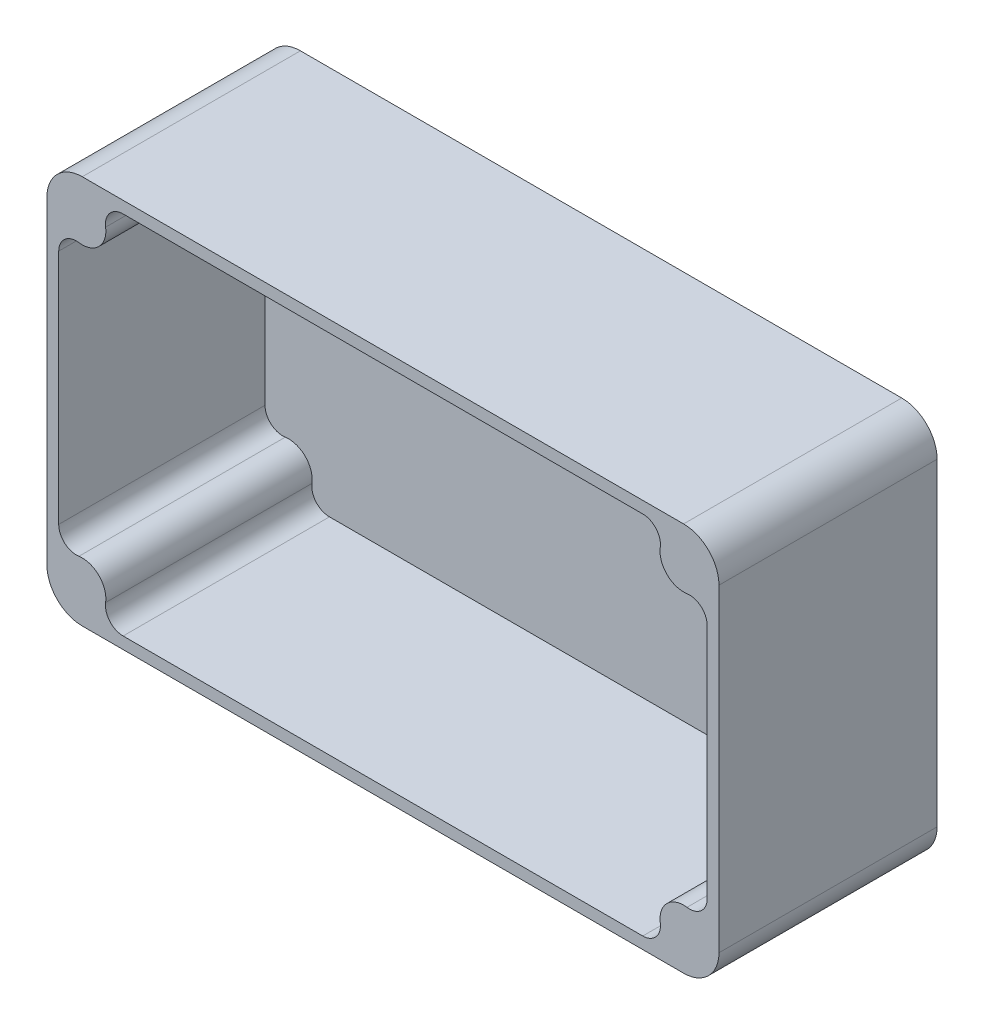
ISO-10303-21;
HEADER;
FILE_DESCRIPTION(('STEP AP214'),'2;1');
FILE_NAME('part.step','',(''),(''),'','','');
FILE_SCHEMA(('AUTOMOTIVE_DESIGN { 1 0 10303 214 1 1 1 1 }'));
ENDSEC;
DATA;
#1=APPLICATION_CONTEXT('core data for automotive mechanical design processes');
#2=APPLICATION_PROTOCOL_DEFINITION('international standard','automotive_design',2000,#1);
#3=PRODUCT_CONTEXT('',#1,'mechanical');
#4=PRODUCT('Part','Part','',(#3));
#5=PRODUCT_RELATED_PRODUCT_CATEGORY('part','',(#4));
#6=PRODUCT_DEFINITION_FORMATION('','',#4);
#7=PRODUCT_DEFINITION_CONTEXT('part definition',#1,'design');
#8=PRODUCT_DEFINITION('design','',#6,#7);
#9=PRODUCT_DEFINITION_SHAPE('','',#8);
#10=(LENGTH_UNIT() NAMED_UNIT(*) SI_UNIT(.MILLI.,.METRE.));
#11=(NAMED_UNIT(*) PLANE_ANGLE_UNIT() SI_UNIT($,.RADIAN.));
#12=(NAMED_UNIT(*) SI_UNIT($,.STERADIAN.) SOLID_ANGLE_UNIT());
#13=UNCERTAINTY_MEASURE_WITH_UNIT(LENGTH_MEASURE(1.E-05),#10,'distance_accuracy_value','');
#14=(GEOMETRIC_REPRESENTATION_CONTEXT(3) GLOBAL_UNCERTAINTY_ASSIGNED_CONTEXT((#13)) GLOBAL_UNIT_ASSIGNED_CONTEXT((#10,
#11,#12)) REPRESENTATION_CONTEXT('',''));
#15=CARTESIAN_POINT('',(0.,0.,0.));
#16=DIRECTION('',(0.,0.,1.));
#17=DIRECTION('',(1.,0.,0.));
#18=AXIS2_PLACEMENT_3D('',#15,#16,#17);
#19=CARTESIAN_POINT('',(51.,-27.,0.));
#20=DIRECTION('',(0.,0.,1.));
#21=DIRECTION('',(1.,0.,0.));
#22=AXIS2_PLACEMENT_3D('',#19,#20,#21);
#23=PLANE('',#22);
#24=DIRECTION('',(1.,0.,0.));
#25=VECTOR('',#24,1.);
#26=CARTESIAN_POINT('',(-51.,-31.,0.));
#27=LINE('',#26,#25);
#28=CARTESIAN_POINT('',(-44.0717967697245,-31.,0.));
#29=VERTEX_POINT('',#28);
#30=CARTESIAN_POINT('',(44.0717967697245,-31.,0.));
#31=VERTEX_POINT('',#30);
#32=EDGE_CURVE('E366',#29,#31,#27,.T.);
#33=ORIENTED_EDGE('',*,*,#32,.T.);
#34=CARTESIAN_POINT('',(44.0717967697245,-28.,0.));
#35=DIRECTION('',(0.,0.,1.));
#36=DIRECTION('',(1.,0.,0.));
#37=AXIS2_PLACEMENT_3D('',#34,#35,#36);
#38=CIRCLE('',#37,3.);
#39=CARTESIAN_POINT('',(47.0410267255568,-27.5714285714286,0.));
#40=VERTEX_POINT('',#39);
#41=EDGE_CURVE('E285',#31,#40,#38,.T.);
#42=ORIENTED_EDGE('',*,*,#41,.T.);
#43=CARTESIAN_POINT('',(51.,-27.,0.));
#44=DIRECTION('',(0.,0.,1.));
#45=DIRECTION('',(1.,0.,0.));
#46=AXIS2_PLACEMENT_3D('',#43,#44,#45);
#47=CIRCLE('',#46,4.00000000000001);
#48=CARTESIAN_POINT('',(51.5714285714286,-23.0410267255568,0.));
#49=VERTEX_POINT('',#48);
#50=EDGE_CURVE('E452',#49,#40,#47,.T.);
#51=ORIENTED_EDGE('',*,*,#50,.F.);
#52=CARTESIAN_POINT('',(52.,-20.0717967697245,0.));
#53=DIRECTION('',(0.,0.,1.));
#54=DIRECTION('',(1.,0.,0.));
#55=AXIS2_PLACEMENT_3D('',#52,#53,#54);
#56=CIRCLE('',#55,3.);
#57=CARTESIAN_POINT('',(55.,-20.0717967697245,0.));
#58=VERTEX_POINT('',#57);
#59=EDGE_CURVE('E283',#49,#58,#56,.T.);
#60=ORIENTED_EDGE('',*,*,#59,.T.);
#61=DIRECTION('',(0.,1.,0.));
#62=VECTOR('',#61,1.);
#63=CARTESIAN_POINT('',(55.,-27.,0.));
#64=LINE('',#63,#62);
#65=CARTESIAN_POINT('',(55.,20.0717967697245,0.));
#66=VERTEX_POINT('',#65);
#67=EDGE_CURVE('E369',#58,#66,#64,.T.);
#68=ORIENTED_EDGE('',*,*,#67,.T.);
#69=CARTESIAN_POINT('',(52.,20.0717967697245,0.));
#70=DIRECTION('',(0.,0.,1.));
#71=DIRECTION('',(1.,0.,0.));
#72=AXIS2_PLACEMENT_3D('',#69,#70,#71);
#73=CIRCLE('',#72,3.);
#74=CARTESIAN_POINT('',(51.5714285714286,23.0410267255569,0.));
#75=VERTEX_POINT('',#74);
#76=EDGE_CURVE('E281',#66,#75,#73,.T.);
#77=ORIENTED_EDGE('',*,*,#76,.T.);
#78=CARTESIAN_POINT('',(51.,27.,0.));
#79=DIRECTION('',(0.,0.,1.));
#80=DIRECTION('',(1.,0.,0.));
#81=AXIS2_PLACEMENT_3D('',#78,#79,#80);
#82=CIRCLE('',#81,4.00000000000001);
#83=CARTESIAN_POINT('',(47.0410267255568,27.5714285714286,0.));
#84=VERTEX_POINT('',#83);
#85=EDGE_CURVE('E263',#75,#84,#82,.F.);
#86=ORIENTED_EDGE('',*,*,#85,.T.);
#87=CARTESIAN_POINT('',(44.0717967697245,28.,0.));
#88=DIRECTION('',(0.,0.,1.));
#89=DIRECTION('',(1.,0.,0.));
#90=AXIS2_PLACEMENT_3D('',#87,#88,#89);
#91=CIRCLE('',#90,3.);
#92=CARTESIAN_POINT('',(44.0717967697245,31.,0.));
#93=VERTEX_POINT('',#92);
#94=EDGE_CURVE('E279',#84,#93,#91,.T.);
#95=ORIENTED_EDGE('',*,*,#94,.T.);
#96=DIRECTION('',(-1.,0.,0.));
#97=VECTOR('',#96,1.);
#98=CARTESIAN_POINT('',(-51.,31.,0.));
#99=LINE('',#98,#97);
#100=CARTESIAN_POINT('',(-44.0717967697245,31.,0.));
#101=VERTEX_POINT('',#100);
#102=EDGE_CURVE('E354',#93,#101,#99,.T.);
#103=ORIENTED_EDGE('',*,*,#102,.T.);
#104=CARTESIAN_POINT('',(-44.0717967697245,28.,0.));
#105=DIRECTION('',(0.,0.,1.));
#106=DIRECTION('',(1.,0.,0.));
#107=AXIS2_PLACEMENT_3D('',#104,#105,#106);
#108=CIRCLE('',#107,3.);
#109=CARTESIAN_POINT('',(-47.0410267255569,27.5714285714286,0.));
#110=VERTEX_POINT('',#109);
#111=EDGE_CURVE('E273',#101,#110,#108,.T.);
#112=ORIENTED_EDGE('',*,*,#111,.T.);
#113=CARTESIAN_POINT('',(-51.,27.,0.));
#114=DIRECTION('',(0.,0.,1.));
#115=DIRECTION('',(1.,0.,0.));
#116=AXIS2_PLACEMENT_3D('',#113,#114,#115);
#117=CIRCLE('',#116,4.);
#118=CARTESIAN_POINT('',(-51.5714285714286,23.0410267255569,0.));
#119=VERTEX_POINT('',#118);
#120=EDGE_CURVE('E260',#110,#119,#117,.F.);
#121=ORIENTED_EDGE('',*,*,#120,.T.);
#122=CARTESIAN_POINT('',(-52.,20.0717967697245,0.));
#123=DIRECTION('',(0.,0.,1.));
#124=DIRECTION('',(1.,0.,0.));
#125=AXIS2_PLACEMENT_3D('',#122,#123,#124);
#126=CIRCLE('',#125,3.);
#127=CARTESIAN_POINT('',(-55.,20.0717967697245,0.));
#128=VERTEX_POINT('',#127);
#129=EDGE_CURVE('E271',#119,#128,#126,.T.);
#130=ORIENTED_EDGE('',*,*,#129,.T.);
#131=DIRECTION('',(0.,-1.,0.));
#132=VECTOR('',#131,1.);
#133=CARTESIAN_POINT('',(-55.,-27.,0.));
#134=LINE('',#133,#132);
#135=CARTESIAN_POINT('',(-55.,-20.0717967697245,0.));
#136=VERTEX_POINT('',#135);
#137=EDGE_CURVE('E361',#128,#136,#134,.T.);
#138=ORIENTED_EDGE('',*,*,#137,.T.);
#139=CARTESIAN_POINT('',(-52.,-20.0717967697245,0.));
#140=DIRECTION('',(0.,0.,1.));
#141=DIRECTION('',(1.,0.,0.));
#142=AXIS2_PLACEMENT_3D('',#139,#140,#141);
#143=CIRCLE('',#142,3.);
#144=CARTESIAN_POINT('',(-51.5714285714286,-23.0410267255569,0.));
#145=VERTEX_POINT('',#144);
#146=EDGE_CURVE('E277',#136,#145,#143,.T.);
#147=ORIENTED_EDGE('',*,*,#146,.T.);
#148=CARTESIAN_POINT('',(-51.,-27.,0.));
#149=DIRECTION('',(0.,0.,1.));
#150=DIRECTION('',(1.,0.,0.));
#151=AXIS2_PLACEMENT_3D('',#148,#149,#150);
#152=CIRCLE('',#151,4.);
#153=CARTESIAN_POINT('',(-47.0410267255569,-27.5714285714286,0.));
#154=VERTEX_POINT('',#153);
#155=EDGE_CURVE('E459',#154,#145,#152,.T.);
#156=ORIENTED_EDGE('',*,*,#155,.F.);
#157=CARTESIAN_POINT('',(-44.0717967697245,-28.,0.));
#158=DIRECTION('',(0.,0.,1.));
#159=DIRECTION('',(1.,0.,0.));
#160=AXIS2_PLACEMENT_3D('',#157,#158,#159);
#161=CIRCLE('',#160,3.);
#162=EDGE_CURVE('E275',#154,#29,#161,.T.);
#163=ORIENTED_EDGE('',*,*,#162,.T.);
#164=EDGE_LOOP('',(#33,#42,#51,#60,#68,#77,#86,#95,#103,#112,#121,#130,#138,#147,#156,#163));
#165=FACE_BOUND('',#164,.T.);
#166=ADVANCED_FACE('F33',(#165),#23,.T.);
#167=CARTESIAN_POINT('',(51.,-27.,35.));
#168=DIRECTION('',(0.,0.,-1.));
#169=DIRECTION('',(-1.,0.,0.));
#170=AXIS2_PLACEMENT_3D('',#167,#168,#169);
#171=CYLINDRICAL_SURFACE('',#170,6.);
#172=CARTESIAN_POINT('',(51.,-27.,-2.));
#173=DIRECTION('',(0.,0.,1.));
#174=DIRECTION('',(1.,0.,0.));
#175=AXIS2_PLACEMENT_3D('',#172,#173,#174);
#176=CIRCLE('',#175,6.);
#177=CARTESIAN_POINT('',(51.,-33.,-2.));
#178=VERTEX_POINT('',#177);
#179=CARTESIAN_POINT('',(57.,-27.,-2.));
#180=VERTEX_POINT('',#179);
#181=EDGE_CURVE('E206',#178,#180,#176,.T.);
#182=ORIENTED_EDGE('',*,*,#181,.T.);
#183=DIRECTION('',(0.,0.,1.));
#184=VECTOR('',#183,1.);
#185=CARTESIAN_POINT('',(57.,-27.,35.));
#186=LINE('',#185,#184);
#187=CARTESIAN_POINT('',(57.,-27.,35.));
#188=VERTEX_POINT('',#187);
#189=EDGE_CURVE('E200',#188,#180,#186,.F.);
#190=ORIENTED_EDGE('',*,*,#189,.F.);
#191=CARTESIAN_POINT('',(51.,-27.,35.));
#192=DIRECTION('',(0.,0.,1.));
#193=DIRECTION('',(1.,0.,0.));
#194=AXIS2_PLACEMENT_3D('',#191,#192,#193);
#195=CIRCLE('',#194,6.);
#196=CARTESIAN_POINT('',(51.,-33.,35.));
#197=VERTEX_POINT('',#196);
#198=EDGE_CURVE('E244',#197,#188,#195,.T.);
#199=ORIENTED_EDGE('',*,*,#198,.F.);
#200=DIRECTION('',(0.,0.,-1.));
#201=VECTOR('',#200,1.);
#202=CARTESIAN_POINT('',(51.,-33.,35.));
#203=LINE('',#202,#201);
#204=EDGE_CURVE('E242',#197,#178,#203,.T.);
#205=ORIENTED_EDGE('',*,*,#204,.T.);
#206=EDGE_LOOP('',(#182,#190,#199,#205));
#207=FACE_BOUND('',#206,.T.);
#208=ADVANCED_FACE('F380',(#207),#171,.T.);
#209=CARTESIAN_POINT('',(57.,-27.,35.));
#210=DIRECTION('',(-1.,0.,0.));
#211=DIRECTION('',(0.,0.,1.));
#212=AXIS2_PLACEMENT_3D('',#209,#210,#211);
#213=PLANE('',#212);
#214=DIRECTION('',(0.,1.,0.));
#215=VECTOR('',#214,1.);
#216=CARTESIAN_POINT('',(57.,-27.,-2.));
#217=LINE('',#216,#215);
#218=CARTESIAN_POINT('',(57.,27.,-2.));
#219=VERTEX_POINT('',#218);
#220=EDGE_CURVE('E194',#180,#219,#217,.T.);
#221=ORIENTED_EDGE('',*,*,#220,.T.);
#222=DIRECTION('',(0.,0.,-1.));
#223=VECTOR('',#222,1.);
#224=CARTESIAN_POINT('',(57.,27.,35.));
#225=LINE('',#224,#223);
#226=CARTESIAN_POINT('',(57.,27.,35.));
#227=VERTEX_POINT('',#226);
#228=EDGE_CURVE('E197',#227,#219,#225,.T.);
#229=ORIENTED_EDGE('',*,*,#228,.F.);
#230=DIRECTION('',(0.,1.,0.));
#231=VECTOR('',#230,1.);
#232=CARTESIAN_POINT('',(57.,-27.,35.));
#233=LINE('',#232,#231);
#234=EDGE_CURVE('E247',#188,#227,#233,.T.);
#235=ORIENTED_EDGE('',*,*,#234,.F.);
#236=ORIENTED_EDGE('',*,*,#189,.T.);
#237=EDGE_LOOP('',(#221,#229,#235,#236));
#238=FACE_BOUND('',#237,.T.);
#239=ADVANCED_FACE('F196',(#238),#213,.F.);
#240=CARTESIAN_POINT('',(51.,27.,35.));
#241=DIRECTION('',(0.,0.,-1.));
#242=DIRECTION('',(-1.,0.,0.));
#243=AXIS2_PLACEMENT_3D('',#240,#241,#242);
#244=CYLINDRICAL_SURFACE('',#243,6.);
#245=CARTESIAN_POINT('',(51.,27.,-2.));
#246=DIRECTION('',(0.,0.,1.));
#247=DIRECTION('',(1.,0.,0.));
#248=AXIS2_PLACEMENT_3D('',#245,#246,#247);
#249=CIRCLE('',#248,6.);
#250=CARTESIAN_POINT('',(51.,33.,-2.));
#251=VERTEX_POINT('',#250);
#252=EDGE_CURVE('E205',#219,#251,#249,.T.);
#253=ORIENTED_EDGE('',*,*,#252,.T.);
#254=DIRECTION('',(0.,0.,-1.));
#255=VECTOR('',#254,1.);
#256=CARTESIAN_POINT('',(51.,33.,35.));
#257=LINE('',#256,#255);
#258=CARTESIAN_POINT('',(51.,33.,35.));
#259=VERTEX_POINT('',#258);
#260=EDGE_CURVE('E213',#259,#251,#257,.T.);
#261=ORIENTED_EDGE('',*,*,#260,.F.);
#262=CARTESIAN_POINT('',(51.,27.,35.));
#263=DIRECTION('',(0.,0.,1.));
#264=DIRECTION('',(1.,0.,0.));
#265=AXIS2_PLACEMENT_3D('',#262,#263,#264);
#266=CIRCLE('',#265,6.);
#267=EDGE_CURVE('E212',#227,#259,#266,.T.);
#268=ORIENTED_EDGE('',*,*,#267,.F.);
#269=ORIENTED_EDGE('',*,*,#228,.T.);
#270=EDGE_LOOP('',(#253,#261,#268,#269));
#271=FACE_BOUND('',#270,.T.);
#272=ADVANCED_FACE('F209',(#271),#244,.T.);
#273=CARTESIAN_POINT('',(-51.,33.,35.));
#274=DIRECTION('',(0.,-1.,0.));
#275=DIRECTION('',(0.,0.,-1.));
#276=AXIS2_PLACEMENT_3D('',#273,#274,#275);
#277=PLANE('',#276);
#278=DIRECTION('',(-1.,0.,0.));
#279=VECTOR('',#278,1.);
#280=CARTESIAN_POINT('',(-51.,33.,-2.));
#281=LINE('',#280,#279);
#282=CARTESIAN_POINT('',(-51.,33.,-2.));
#283=VERTEX_POINT('',#282);
#284=EDGE_CURVE('E218',#251,#283,#281,.T.);
#285=ORIENTED_EDGE('',*,*,#284,.T.);
#286=DIRECTION('',(0.,0.,-1.));
#287=VECTOR('',#286,1.);
#288=CARTESIAN_POINT('',(-51.,33.,35.));
#289=LINE('',#288,#287);
#290=CARTESIAN_POINT('',(-51.,33.,35.));
#291=VERTEX_POINT('',#290);
#292=EDGE_CURVE('E223',#291,#283,#289,.T.);
#293=ORIENTED_EDGE('',*,*,#292,.F.);
#294=DIRECTION('',(-1.,0.,0.));
#295=VECTOR('',#294,1.);
#296=CARTESIAN_POINT('',(-51.,33.,35.));
#297=LINE('',#296,#295);
#298=EDGE_CURVE('E250',#259,#291,#297,.T.);
#299=ORIENTED_EDGE('',*,*,#298,.F.);
#300=ORIENTED_EDGE('',*,*,#260,.T.);
#301=EDGE_LOOP('',(#285,#293,#299,#300));
#302=FACE_BOUND('',#301,.T.);
#303=ADVANCED_FACE('F402',(#302),#277,.F.);
#304=CARTESIAN_POINT('',(-51.,27.,35.));
#305=DIRECTION('',(0.,0.,-1.));
#306=DIRECTION('',(-1.,0.,0.));
#307=AXIS2_PLACEMENT_3D('',#304,#305,#306);
#308=CYLINDRICAL_SURFACE('',#307,6.);
#309=CARTESIAN_POINT('',(-51.,27.,-2.));
#310=DIRECTION('',(0.,0.,1.));
#311=DIRECTION('',(1.,0.,0.));
#312=AXIS2_PLACEMENT_3D('',#309,#310,#311);
#313=CIRCLE('',#312,6.);
#314=CARTESIAN_POINT('',(-57.,27.,-2.));
#315=VERTEX_POINT('',#314);
#316=EDGE_CURVE('E220',#283,#315,#313,.T.);
#317=ORIENTED_EDGE('',*,*,#316,.T.);
#318=DIRECTION('',(0.,0.,-1.));
#319=VECTOR('',#318,1.);
#320=CARTESIAN_POINT('',(-57.,27.,35.));
#321=LINE('',#320,#319);
#322=CARTESIAN_POINT('',(-57.,27.,35.));
#323=VERTEX_POINT('',#322);
#324=EDGE_CURVE('E227',#323,#315,#321,.T.);
#325=ORIENTED_EDGE('',*,*,#324,.F.);
#326=CARTESIAN_POINT('',(-51.,27.,35.));
#327=DIRECTION('',(0.,0.,1.));
#328=DIRECTION('',(1.,0.,0.));
#329=AXIS2_PLACEMENT_3D('',#326,#327,#328);
#330=CIRCLE('',#329,6.);
#331=EDGE_CURVE('E252',#291,#323,#330,.T.);
#332=ORIENTED_EDGE('',*,*,#331,.F.);
#333=ORIENTED_EDGE('',*,*,#292,.T.);
#334=EDGE_LOOP('',(#317,#325,#332,#333));
#335=FACE_BOUND('',#334,.T.);
#336=ADVANCED_FACE('F397',(#335),#308,.T.);
#337=CARTESIAN_POINT('',(-57.,-27.,35.));
#338=DIRECTION('',(1.,0.,0.));
#339=DIRECTION('',(0.,0.,-1.));
#340=AXIS2_PLACEMENT_3D('',#337,#338,#339);
#341=PLANE('',#340);
#342=DIRECTION('',(0.,-1.,0.));
#343=VECTOR('',#342,1.);
#344=CARTESIAN_POINT('',(-57.,-27.,-2.));
#345=LINE('',#344,#343);
#346=CARTESIAN_POINT('',(-57.,-27.,-2.));
#347=VERTEX_POINT('',#346);
#348=EDGE_CURVE('E229',#315,#347,#345,.T.);
#349=ORIENTED_EDGE('',*,*,#348,.T.);
#350=DIRECTION('',(0.,0.,-1.));
#351=VECTOR('',#350,1.);
#352=CARTESIAN_POINT('',(-57.,-27.,35.));
#353=LINE('',#352,#351);
#354=CARTESIAN_POINT('',(-57.,-27.,35.));
#355=VERTEX_POINT('',#354);
#356=EDGE_CURVE('E232',#355,#347,#353,.T.);
#357=ORIENTED_EDGE('',*,*,#356,.F.);
#358=DIRECTION('',(0.,-1.,0.));
#359=VECTOR('',#358,1.);
#360=CARTESIAN_POINT('',(-57.,-27.,35.));
#361=LINE('',#360,#359);
#362=EDGE_CURVE('E254',#323,#355,#361,.T.);
#363=ORIENTED_EDGE('',*,*,#362,.F.);
#364=ORIENTED_EDGE('',*,*,#324,.T.);
#365=EDGE_LOOP('',(#349,#357,#363,#364));
#366=FACE_BOUND('',#365,.T.);
#367=ADVANCED_FACE('F394',(#366),#341,.F.);
#368=CARTESIAN_POINT('',(-51.,-27.,35.));
#369=DIRECTION('',(0.,0.,-1.));
#370=DIRECTION('',(-1.,0.,0.));
#371=AXIS2_PLACEMENT_3D('',#368,#369,#370);
#372=CYLINDRICAL_SURFACE('',#371,6.);
#373=CARTESIAN_POINT('',(-51.,-27.,-2.));
#374=DIRECTION('',(0.,0.,1.));
#375=DIRECTION('',(1.,0.,0.));
#376=AXIS2_PLACEMENT_3D('',#373,#374,#375);
#377=CIRCLE('',#376,6.);
#378=CARTESIAN_POINT('',(-51.,-33.,-2.));
#379=VERTEX_POINT('',#378);
#380=EDGE_CURVE('E234',#347,#379,#377,.T.);
#381=ORIENTED_EDGE('',*,*,#380,.T.);
#382=DIRECTION('',(0.,0.,1.));
#383=VECTOR('',#382,1.);
#384=CARTESIAN_POINT('',(-51.,-33.,35.));
#385=LINE('',#384,#383);
#386=CARTESIAN_POINT('',(-51.,-33.,35.));
#387=VERTEX_POINT('',#386);
#388=EDGE_CURVE('E237',#387,#379,#385,.F.);
#389=ORIENTED_EDGE('',*,*,#388,.F.);
#390=CARTESIAN_POINT('',(-51.,-27.,35.));
#391=DIRECTION('',(0.,0.,1.));
#392=DIRECTION('',(1.,0.,0.));
#393=AXIS2_PLACEMENT_3D('',#390,#391,#392);
#394=CIRCLE('',#393,6.);
#395=EDGE_CURVE('E256',#355,#387,#394,.T.);
#396=ORIENTED_EDGE('',*,*,#395,.F.);
#397=ORIENTED_EDGE('',*,*,#356,.T.);
#398=EDGE_LOOP('',(#381,#389,#396,#397));
#399=FACE_BOUND('',#398,.T.);
#400=ADVANCED_FACE('F390',(#399),#372,.T.);
#401=CARTESIAN_POINT('',(-51.,-33.,35.));
#402=DIRECTION('',(0.,1.,0.));
#403=DIRECTION('',(0.,0.,1.));
#404=AXIS2_PLACEMENT_3D('',#401,#402,#403);
#405=PLANE('',#404);
#406=DIRECTION('',(1.,0.,0.));
#407=VECTOR('',#406,1.);
#408=CARTESIAN_POINT('',(-51.,-33.,-2.));
#409=LINE('',#408,#407);
#410=EDGE_CURVE('E239',#379,#178,#409,.T.);
#411=ORIENTED_EDGE('',*,*,#410,.T.);
#412=ORIENTED_EDGE('',*,*,#204,.F.);
#413=DIRECTION('',(1.,0.,0.));
#414=VECTOR('',#413,1.);
#415=CARTESIAN_POINT('',(-51.,-33.,35.));
#416=LINE('',#415,#414);
#417=EDGE_CURVE('E258',#387,#197,#416,.T.);
#418=ORIENTED_EDGE('',*,*,#417,.F.);
#419=ORIENTED_EDGE('',*,*,#388,.T.);
#420=EDGE_LOOP('',(#411,#412,#418,#419));
#421=FACE_BOUND('',#420,.T.);
#422=ADVANCED_FACE('F386',(#421),#405,.F.);
#423=CARTESIAN_POINT('',(51.,-27.,35.));
#424=DIRECTION('',(0.,0.,1.));
#425=DIRECTION('',(1.,0.,0.));
#426=AXIS2_PLACEMENT_3D('',#423,#424,#425);
#427=PLANE('',#426);
#428=DIRECTION('',(0.,1.,0.));
#429=VECTOR('',#428,1.);
#430=CARTESIAN_POINT('',(55.,-27.,35.));
#431=LINE('',#430,#429);
#432=CARTESIAN_POINT('',(55.,-20.0717967697245,35.));
#433=VERTEX_POINT('',#432);
#434=CARTESIAN_POINT('',(55.,20.0717967697245,35.));
#435=VERTEX_POINT('',#434);
#436=EDGE_CURVE('E349',#433,#435,#431,.T.);
#437=ORIENTED_EDGE('',*,*,#436,.F.);
#438=CARTESIAN_POINT('',(52.,-20.0717967697245,35.));
#439=DIRECTION('',(0.,0.,1.));
#440=DIRECTION('',(1.,0.,0.));
#441=AXIS2_PLACEMENT_3D('',#438,#439,#440);
#442=CIRCLE('',#441,3.);
#443=CARTESIAN_POINT('',(51.5714285714286,-23.0410267255568,35.));
#444=VERTEX_POINT('',#443);
#445=EDGE_CURVE('E323',#433,#444,#442,.F.);
#446=ORIENTED_EDGE('',*,*,#445,.T.);
#447=CARTESIAN_POINT('',(51.,-27.,35.));
#448=DIRECTION('',(0.,0.,1.));
#449=DIRECTION('',(1.,0.,0.));
#450=AXIS2_PLACEMENT_3D('',#447,#448,#449);
#451=CIRCLE('',#450,4.00000000000001);
#452=CARTESIAN_POINT('',(47.0410267255568,-27.5714285714286,35.));
#453=VERTEX_POINT('',#452);
#454=EDGE_CURVE('E444',#444,#453,#451,.T.);
#455=ORIENTED_EDGE('',*,*,#454,.T.);
#456=CARTESIAN_POINT('',(44.0717967697245,-28.,35.));
#457=DIRECTION('',(0.,0.,1.));
#458=DIRECTION('',(1.,0.,0.));
#459=AXIS2_PLACEMENT_3D('',#456,#457,#458);
#460=CIRCLE('',#459,3.);
#461=CARTESIAN_POINT('',(44.0717967697245,-31.,35.));
#462=VERTEX_POINT('',#461);
#463=EDGE_CURVE('E321',#453,#462,#460,.F.);
#464=ORIENTED_EDGE('',*,*,#463,.T.);
#465=DIRECTION('',(1.,0.,0.));
#466=VECTOR('',#465,1.);
#467=CARTESIAN_POINT('',(-51.,-31.,35.));
#468=LINE('',#467,#466);
#469=CARTESIAN_POINT('',(-44.0717967697245,-31.,35.));
#470=VERTEX_POINT('',#469);
#471=EDGE_CURVE('E374',#470,#462,#468,.T.);
#472=ORIENTED_EDGE('',*,*,#471,.F.);
#473=CARTESIAN_POINT('',(-44.0717967697245,-28.,35.));
#474=DIRECTION('',(0.,0.,1.));
#475=DIRECTION('',(1.,0.,0.));
#476=AXIS2_PLACEMENT_3D('',#473,#474,#475);
#477=CIRCLE('',#476,3.);
#478=CARTESIAN_POINT('',(-47.0410267255569,-27.5714285714286,35.));
#479=VERTEX_POINT('',#478);
#480=EDGE_CURVE('E331',#470,#479,#477,.F.);
#481=ORIENTED_EDGE('',*,*,#480,.T.);
#482=CARTESIAN_POINT('',(-51.,-27.,35.));
#483=DIRECTION('',(0.,0.,1.));
#484=DIRECTION('',(1.,0.,0.));
#485=AXIS2_PLACEMENT_3D('',#482,#483,#484);
#486=CIRCLE('',#485,4.);
#487=CARTESIAN_POINT('',(-51.5714285714286,-23.0410267255569,35.));
#488=VERTEX_POINT('',#487);
#489=EDGE_CURVE('E456',#479,#488,#486,.T.);
#490=ORIENTED_EDGE('',*,*,#489,.T.);
#491=CARTESIAN_POINT('',(-52.,-20.0717967697245,35.));
#492=DIRECTION('',(0.,0.,1.));
#493=DIRECTION('',(1.,0.,0.));
#494=AXIS2_PLACEMENT_3D('',#491,#492,#493);
#495=CIRCLE('',#494,3.);
#496=CARTESIAN_POINT('',(-55.,-20.0717967697245,35.));
#497=VERTEX_POINT('',#496);
#498=EDGE_CURVE('E329',#488,#497,#495,.F.);
#499=ORIENTED_EDGE('',*,*,#498,.T.);
#500=DIRECTION('',(0.,-1.,0.));
#501=VECTOR('',#500,1.);
#502=CARTESIAN_POINT('',(-55.,-27.,35.));
#503=LINE('',#502,#501);
#504=CARTESIAN_POINT('',(-55.,20.0717967697245,35.));
#505=VERTEX_POINT('',#504);
#506=EDGE_CURVE('E348',#505,#497,#503,.T.);
#507=ORIENTED_EDGE('',*,*,#506,.F.);
#508=CARTESIAN_POINT('',(-52.,20.0717967697245,35.));
#509=DIRECTION('',(0.,0.,1.));
#510=DIRECTION('',(1.,0.,0.));
#511=AXIS2_PLACEMENT_3D('',#508,#509,#510);
#512=CIRCLE('',#511,3.);
#513=CARTESIAN_POINT('',(-51.5714285714286,23.0410267255569,35.));
#514=VERTEX_POINT('',#513);
#515=EDGE_CURVE('E11',#505,#514,#512,.F.);
#516=ORIENTED_EDGE('',*,*,#515,.T.);
#517=CARTESIAN_POINT('',(-51.,27.,35.));
#518=DIRECTION('',(0.,0.,1.));
#519=DIRECTION('',(1.,0.,0.));
#520=AXIS2_PLACEMENT_3D('',#517,#518,#519);
#521=CIRCLE('',#520,4.);
#522=CARTESIAN_POINT('',(-47.0410267255569,27.5714285714286,35.));
#523=VERTEX_POINT('',#522);
#524=EDGE_CURVE('E340',#514,#523,#521,.T.);
#525=ORIENTED_EDGE('',*,*,#524,.T.);
#526=CARTESIAN_POINT('',(-44.0717967697245,28.,35.));
#527=DIRECTION('',(0.,0.,1.));
#528=DIRECTION('',(1.,0.,0.));
#529=AXIS2_PLACEMENT_3D('',#526,#527,#528);
#530=CIRCLE('',#529,3.);
#531=CARTESIAN_POINT('',(-44.0717967697245,31.,35.));
#532=VERTEX_POINT('',#531);
#533=EDGE_CURVE('E41',#523,#532,#530,.F.);
#534=ORIENTED_EDGE('',*,*,#533,.T.);
#535=DIRECTION('',(-1.,0.,0.));
#536=VECTOR('',#535,1.);
#537=CARTESIAN_POINT('',(-51.,31.,35.));
#538=LINE('',#537,#536);
#539=CARTESIAN_POINT('',(44.0717967697245,31.,35.));
#540=VERTEX_POINT('',#539);
#541=EDGE_CURVE('E338',#540,#532,#538,.T.);
#542=ORIENTED_EDGE('',*,*,#541,.F.);
#543=CARTESIAN_POINT('',(44.0717967697245,28.,35.));
#544=DIRECTION('',(0.,0.,1.));
#545=DIRECTION('',(1.,0.,0.));
#546=AXIS2_PLACEMENT_3D('',#543,#544,#545);
#547=CIRCLE('',#546,3.);
#548=CARTESIAN_POINT('',(47.0410267255568,27.5714285714286,35.));
#549=VERTEX_POINT('',#548);
#550=EDGE_CURVE('E327',#540,#549,#547,.F.);
#551=ORIENTED_EDGE('',*,*,#550,.T.);
#552=CARTESIAN_POINT('',(51.,27.,35.));
#553=DIRECTION('',(0.,0.,1.));
#554=DIRECTION('',(1.,0.,0.));
#555=AXIS2_PLACEMENT_3D('',#552,#553,#554);
#556=CIRCLE('',#555,4.00000000000001);
#557=CARTESIAN_POINT('',(51.5714285714286,23.0410267255569,35.));
#558=VERTEX_POINT('',#557);
#559=EDGE_CURVE('E451',#549,#558,#556,.T.);
#560=ORIENTED_EDGE('',*,*,#559,.T.);
#561=CARTESIAN_POINT('',(52.,20.0717967697245,35.));
#562=DIRECTION('',(0.,0.,1.));
#563=DIRECTION('',(1.,0.,0.));
#564=AXIS2_PLACEMENT_3D('',#561,#562,#563);
#565=CIRCLE('',#564,3.);
#566=EDGE_CURVE('E325',#558,#435,#565,.F.);
#567=ORIENTED_EDGE('',*,*,#566,.T.);
#568=EDGE_LOOP('',(#437,#446,#455,#464,#472,#481,#490,#499,#507,#516,#525,#534,#542,#551,#560,#567));
#569=FACE_BOUND('',#568,.T.);
#570=ORIENTED_EDGE('',*,*,#198,.T.);
#571=ORIENTED_EDGE('',*,*,#234,.T.);
#572=ORIENTED_EDGE('',*,*,#267,.T.);
#573=ORIENTED_EDGE('',*,*,#298,.T.);
#574=ORIENTED_EDGE('',*,*,#331,.T.);
#575=ORIENTED_EDGE('',*,*,#362,.T.);
#576=ORIENTED_EDGE('',*,*,#395,.T.);
#577=ORIENTED_EDGE('',*,*,#417,.T.);
#578=EDGE_LOOP('',(#570,#571,#572,#573,#574,#575,#576,#577));
#579=FACE_BOUND('',#578,.T.);
#580=ADVANCED_FACE('F336',(#569,#579),#427,.T.);
#581=CARTESIAN_POINT('',(51.,-27.,-2.));
#582=DIRECTION('',(0.,0.,1.));
#583=DIRECTION('',(1.,0.,0.));
#584=AXIS2_PLACEMENT_3D('',#581,#582,#583);
#585=PLANE('',#584);
#586=ORIENTED_EDGE('',*,*,#181,.F.);
#587=ORIENTED_EDGE('',*,*,#410,.F.);
#588=ORIENTED_EDGE('',*,*,#380,.F.);
#589=ORIENTED_EDGE('',*,*,#348,.F.);
#590=ORIENTED_EDGE('',*,*,#316,.F.);
#591=ORIENTED_EDGE('',*,*,#284,.F.);
#592=ORIENTED_EDGE('',*,*,#252,.F.);
#593=ORIENTED_EDGE('',*,*,#220,.F.);
#594=EDGE_LOOP('',(#586,#587,#588,#589,#590,#591,#592,#593));
#595=FACE_BOUND('',#594,.T.);
#596=ADVANCED_FACE('F216',(#595),#585,.F.);
#597=CARTESIAN_POINT('',(55.,-27.,35.));
#598=DIRECTION('',(-1.,0.,0.));
#599=DIRECTION('',(0.,0.,1.));
#600=AXIS2_PLACEMENT_3D('',#597,#598,#599);
#601=PLANE('',#600);
#602=ORIENTED_EDGE('',*,*,#67,.F.);
#603=DIRECTION('',(0.,0.,-1.));
#604=VECTOR('',#603,1.);
#605=CARTESIAN_POINT('',(55.,-20.0717967697245,35.));
#606=LINE('',#605,#604);
#607=EDGE_CURVE('E295',#58,#433,#606,.F.);
#608=ORIENTED_EDGE('',*,*,#607,.T.);
#609=ORIENTED_EDGE('',*,*,#436,.T.);
#610=DIRECTION('',(0.,0.,-1.));
#611=VECTOR('',#610,1.);
#612=CARTESIAN_POINT('',(55.,20.0717967697245,35.));
#613=LINE('',#612,#611);
#614=EDGE_CURVE('E292',#435,#66,#613,.T.);
#615=ORIENTED_EDGE('',*,*,#614,.T.);
#616=EDGE_LOOP('',(#602,#608,#609,#615));
#617=FACE_BOUND('',#616,.T.);
#618=ADVANCED_FACE('F409',(#617),#601,.T.);
#619=CARTESIAN_POINT('',(-51.,31.,35.));
#620=DIRECTION('',(0.,-1.,0.));
#621=DIRECTION('',(0.,0.,-1.));
#622=AXIS2_PLACEMENT_3D('',#619,#620,#621);
#623=PLANE('',#622);
#624=ORIENTED_EDGE('',*,*,#102,.F.);
#625=DIRECTION('',(0.,0.,-1.));
#626=VECTOR('',#625,1.);
#627=CARTESIAN_POINT('',(44.0717967697245,31.,35.));
#628=LINE('',#627,#626);
#629=EDGE_CURVE('E305',#93,#540,#628,.F.);
#630=ORIENTED_EDGE('',*,*,#629,.T.);
#631=ORIENTED_EDGE('',*,*,#541,.T.);
#632=DIRECTION('',(0.,0.,-1.));
#633=VECTOR('',#632,1.);
#634=CARTESIAN_POINT('',(-44.0717967697245,31.,35.));
#635=LINE('',#634,#633);
#636=EDGE_CURVE('E302',#532,#101,#635,.T.);
#637=ORIENTED_EDGE('',*,*,#636,.T.);
#638=EDGE_LOOP('',(#624,#630,#631,#637));
#639=FACE_BOUND('',#638,.T.);
#640=ADVANCED_FACE('F345',(#639),#623,.T.);
#641=CARTESIAN_POINT('',(-55.,-27.,35.));
#642=DIRECTION('',(1.,0.,0.));
#643=DIRECTION('',(0.,0.,-1.));
#644=AXIS2_PLACEMENT_3D('',#641,#642,#643);
#645=PLANE('',#644);
#646=ORIENTED_EDGE('',*,*,#506,.T.);
#647=DIRECTION('',(0.,0.,-1.));
#648=VECTOR('',#647,1.);
#649=CARTESIAN_POINT('',(-55.,-20.0717967697245,35.));
#650=LINE('',#649,#648);
#651=EDGE_CURVE('E309',#497,#136,#650,.T.);
#652=ORIENTED_EDGE('',*,*,#651,.T.);
#653=ORIENTED_EDGE('',*,*,#137,.F.);
#654=DIRECTION('',(0.,0.,-1.));
#655=VECTOR('',#654,1.);
#656=CARTESIAN_POINT('',(-55.,20.0717967697245,35.));
#657=LINE('',#656,#655);
#658=EDGE_CURVE('E307',#128,#505,#657,.F.);
#659=ORIENTED_EDGE('',*,*,#658,.T.);
#660=EDGE_LOOP('',(#646,#652,#653,#659));
#661=FACE_BOUND('',#660,.T.);
#662=ADVANCED_FACE('F364',(#661),#645,.T.);
#663=CARTESIAN_POINT('',(-51.,-31.,35.));
#664=DIRECTION('',(0.,1.,0.));
#665=DIRECTION('',(0.,0.,1.));
#666=AXIS2_PLACEMENT_3D('',#663,#664,#665);
#667=PLANE('',#666);
#668=ORIENTED_EDGE('',*,*,#471,.T.);
#669=DIRECTION('',(0.,0.,-1.));
#670=VECTOR('',#669,1.);
#671=CARTESIAN_POINT('',(44.0717967697245,-31.,35.));
#672=LINE('',#671,#670);
#673=EDGE_CURVE('E268',#462,#31,#672,.T.);
#674=ORIENTED_EDGE('',*,*,#673,.T.);
#675=ORIENTED_EDGE('',*,*,#32,.F.);
#676=DIRECTION('',(0.,0.,-1.));
#677=VECTOR('',#676,1.);
#678=CARTESIAN_POINT('',(-44.0717967697245,-31.,35.));
#679=LINE('',#678,#677);
#680=EDGE_CURVE('E266',#29,#470,#679,.F.);
#681=ORIENTED_EDGE('',*,*,#680,.T.);
#682=EDGE_LOOP('',(#668,#674,#675,#681));
#683=FACE_BOUND('',#682,.T.);
#684=ADVANCED_FACE('F422',(#683),#667,.T.);
#685=CARTESIAN_POINT('',(-51.,27.,35.));
#686=DIRECTION('',(0.,0.,-1.));
#687=DIRECTION('',(-1.,0.,0.));
#688=AXIS2_PLACEMENT_3D('',#685,#686,#687);
#689=CYLINDRICAL_SURFACE('',#688,4.);
#690=ORIENTED_EDGE('',*,*,#120,.F.);
#691=DIRECTION('',(0.,0.,-1.));
#692=VECTOR('',#691,1.);
#693=CARTESIAN_POINT('',(-47.0410267255569,27.5714285714286,35.));
#694=LINE('',#693,#692);
#695=EDGE_CURVE('E48',#110,#523,#694,.F.);
#696=ORIENTED_EDGE('',*,*,#695,.T.);
#697=ORIENTED_EDGE('',*,*,#524,.F.);
#698=DIRECTION('',(0.,0.,-1.));
#699=VECTOR('',#698,1.);
#700=CARTESIAN_POINT('',(-51.5714285714286,23.0410267255569,35.));
#701=LINE('',#700,#699);
#702=EDGE_CURVE('E317',#514,#119,#701,.T.);
#703=ORIENTED_EDGE('',*,*,#702,.T.);
#704=EDGE_LOOP('',(#690,#696,#697,#703));
#705=FACE_BOUND('',#704,.T.);
#706=ADVANCED_FACE('F355',(#705),#689,.T.);
#707=CARTESIAN_POINT('',(51.,27.,35.));
#708=DIRECTION('',(0.,0.,-1.));
#709=DIRECTION('',(-1.,0.,0.));
#710=AXIS2_PLACEMENT_3D('',#707,#708,#709);
#711=CYLINDRICAL_SURFACE('',#710,4.00000000000001);
#712=ORIENTED_EDGE('',*,*,#85,.F.);
#713=DIRECTION('',(0.,0.,-1.));
#714=VECTOR('',#713,1.);
#715=CARTESIAN_POINT('',(51.5714285714286,23.0410267255569,35.));
#716=LINE('',#715,#714);
#717=EDGE_CURVE('E300',#75,#558,#716,.F.);
#718=ORIENTED_EDGE('',*,*,#717,.T.);
#719=ORIENTED_EDGE('',*,*,#559,.F.);
#720=DIRECTION('',(0.,0.,-1.));
#721=VECTOR('',#720,1.);
#722=CARTESIAN_POINT('',(47.0410267255568,27.5714285714286,35.));
#723=LINE('',#722,#721);
#724=EDGE_CURVE('E297',#549,#84,#723,.T.);
#725=ORIENTED_EDGE('',*,*,#724,.T.);
#726=EDGE_LOOP('',(#712,#718,#719,#725));
#727=FACE_BOUND('',#726,.T.);
#728=ADVANCED_FACE('F565',(#727),#711,.T.);
#729=CARTESIAN_POINT('',(51.,-27.,35.));
#730=DIRECTION('',(0.,0.,-1.));
#731=DIRECTION('',(-1.,0.,0.));
#732=AXIS2_PLACEMENT_3D('',#729,#730,#731);
#733=CYLINDRICAL_SURFACE('',#732,4.00000000000001);
#734=ORIENTED_EDGE('',*,*,#50,.T.);
#735=DIRECTION('',(0.,0.,-1.));
#736=VECTOR('',#735,1.);
#737=CARTESIAN_POINT('',(47.0410267255568,-27.5714285714286,35.));
#738=LINE('',#737,#736);
#739=EDGE_CURVE('E290',#40,#453,#738,.F.);
#740=ORIENTED_EDGE('',*,*,#739,.T.);
#741=ORIENTED_EDGE('',*,*,#454,.F.);
#742=DIRECTION('',(0.,0.,-1.));
#743=VECTOR('',#742,1.);
#744=CARTESIAN_POINT('',(51.5714285714286,-23.0410267255568,35.));
#745=LINE('',#744,#743);
#746=EDGE_CURVE('E287',#444,#49,#745,.T.);
#747=ORIENTED_EDGE('',*,*,#746,.T.);
#748=EDGE_LOOP('',(#734,#740,#741,#747));
#749=FACE_BOUND('',#748,.T.);
#750=ADVANCED_FACE('F448',(#749),#733,.T.);
#751=CARTESIAN_POINT('',(-51.,-27.,35.));
#752=DIRECTION('',(0.,0.,-1.));
#753=DIRECTION('',(-1.,0.,0.));
#754=AXIS2_PLACEMENT_3D('',#751,#752,#753);
#755=CYLINDRICAL_SURFACE('',#754,4.);
#756=ORIENTED_EDGE('',*,*,#155,.T.);
#757=DIRECTION('',(0.,0.,-1.));
#758=VECTOR('',#757,1.);
#759=CARTESIAN_POINT('',(-51.5714285714286,-23.0410267255569,35.));
#760=LINE('',#759,#758);
#761=EDGE_CURVE('E315',#145,#488,#760,.F.);
#762=ORIENTED_EDGE('',*,*,#761,.T.);
#763=ORIENTED_EDGE('',*,*,#489,.F.);
#764=DIRECTION('',(0.,0.,-1.));
#765=VECTOR('',#764,1.);
#766=CARTESIAN_POINT('',(-47.0410267255569,-27.5714285714286,35.));
#767=LINE('',#766,#765);
#768=EDGE_CURVE('E312',#479,#154,#767,.T.);
#769=ORIENTED_EDGE('',*,*,#768,.T.);
#770=EDGE_LOOP('',(#756,#762,#763,#769));
#771=FACE_BOUND('',#770,.T.);
#772=ADVANCED_FACE('F482',(#771),#755,.T.);
#773=CARTESIAN_POINT('',(44.0717967697245,-28.,35.));
#774=DIRECTION('',(0.,0.,-1.));
#775=DIRECTION('',(-1.,0.,0.));
#776=AXIS2_PLACEMENT_3D('',#773,#774,#775);
#777=CYLINDRICAL_SURFACE('',#776,3.);
#778=ORIENTED_EDGE('',*,*,#463,.F.);
#779=ORIENTED_EDGE('',*,*,#739,.F.);
#780=ORIENTED_EDGE('',*,*,#41,.F.);
#781=ORIENTED_EDGE('',*,*,#673,.F.);
#782=EDGE_LOOP('',(#778,#779,#780,#781));
#783=FACE_BOUND('',#782,.T.);
#784=ADVANCED_FACE('F472',(#783),#777,.F.);
#785=CARTESIAN_POINT('',(52.,-20.0717967697245,35.));
#786=DIRECTION('',(0.,0.,-1.));
#787=DIRECTION('',(-1.,0.,0.));
#788=AXIS2_PLACEMENT_3D('',#785,#786,#787);
#789=CYLINDRICAL_SURFACE('',#788,3.);
#790=ORIENTED_EDGE('',*,*,#445,.F.);
#791=ORIENTED_EDGE('',*,*,#607,.F.);
#792=ORIENTED_EDGE('',*,*,#59,.F.);
#793=ORIENTED_EDGE('',*,*,#746,.F.);
#794=EDGE_LOOP('',(#790,#791,#792,#793));
#795=FACE_BOUND('',#794,.T.);
#796=ADVANCED_FACE('F440',(#795),#789,.F.);
#797=CARTESIAN_POINT('',(52.,20.0717967697245,35.));
#798=DIRECTION('',(0.,0.,-1.));
#799=DIRECTION('',(-1.,0.,0.));
#800=AXIS2_PLACEMENT_3D('',#797,#798,#799);
#801=CYLINDRICAL_SURFACE('',#800,3.);
#802=ORIENTED_EDGE('',*,*,#566,.F.);
#803=ORIENTED_EDGE('',*,*,#717,.F.);
#804=ORIENTED_EDGE('',*,*,#76,.F.);
#805=ORIENTED_EDGE('',*,*,#614,.F.);
#806=EDGE_LOOP('',(#802,#803,#804,#805));
#807=FACE_BOUND('',#806,.T.);
#808=ADVANCED_FACE('F494',(#807),#801,.F.);
#809=CARTESIAN_POINT('',(44.0717967697245,28.,35.));
#810=DIRECTION('',(0.,0.,-1.));
#811=DIRECTION('',(-1.,0.,0.));
#812=AXIS2_PLACEMENT_3D('',#809,#810,#811);
#813=CYLINDRICAL_SURFACE('',#812,3.);
#814=ORIENTED_EDGE('',*,*,#550,.F.);
#815=ORIENTED_EDGE('',*,*,#629,.F.);
#816=ORIENTED_EDGE('',*,*,#94,.F.);
#817=ORIENTED_EDGE('',*,*,#724,.F.);
#818=EDGE_LOOP('',(#814,#815,#816,#817));
#819=FACE_BOUND('',#818,.T.);
#820=ADVANCED_FACE('F487',(#819),#813,.F.);
#821=CARTESIAN_POINT('',(-52.,-20.0717967697245,35.));
#822=DIRECTION('',(0.,0.,-1.));
#823=DIRECTION('',(-1.,0.,0.));
#824=AXIS2_PLACEMENT_3D('',#821,#822,#823);
#825=CYLINDRICAL_SURFACE('',#824,3.);
#826=ORIENTED_EDGE('',*,*,#498,.F.);
#827=ORIENTED_EDGE('',*,*,#761,.F.);
#828=ORIENTED_EDGE('',*,*,#146,.F.);
#829=ORIENTED_EDGE('',*,*,#651,.F.);
#830=EDGE_LOOP('',(#826,#827,#828,#829));
#831=FACE_BOUND('',#830,.T.);
#832=ADVANCED_FACE('F485',(#831),#825,.F.);
#833=CARTESIAN_POINT('',(-44.0717967697245,-28.,35.));
#834=DIRECTION('',(0.,0.,-1.));
#835=DIRECTION('',(-1.,0.,0.));
#836=AXIS2_PLACEMENT_3D('',#833,#834,#835);
#837=CYLINDRICAL_SURFACE('',#836,3.);
#838=ORIENTED_EDGE('',*,*,#480,.F.);
#839=ORIENTED_EDGE('',*,*,#680,.F.);
#840=ORIENTED_EDGE('',*,*,#162,.F.);
#841=ORIENTED_EDGE('',*,*,#768,.F.);
#842=EDGE_LOOP('',(#838,#839,#840,#841));
#843=FACE_BOUND('',#842,.T.);
#844=ADVANCED_FACE('F475',(#843),#837,.F.);
#845=CARTESIAN_POINT('',(-44.0717967697245,28.,35.));
#846=DIRECTION('',(0.,0.,-1.));
#847=DIRECTION('',(-1.,0.,0.));
#848=AXIS2_PLACEMENT_3D('',#845,#846,#847);
#849=CYLINDRICAL_SURFACE('',#848,3.);
#850=ORIENTED_EDGE('',*,*,#533,.F.);
#851=ORIENTED_EDGE('',*,*,#695,.F.);
#852=ORIENTED_EDGE('',*,*,#111,.F.);
#853=ORIENTED_EDGE('',*,*,#636,.F.);
#854=EDGE_LOOP('',(#850,#851,#852,#853));
#855=FACE_BOUND('',#854,.T.);
#856=ADVANCED_FACE('F351',(#855),#849,.F.);
#857=CARTESIAN_POINT('',(-52.,20.0717967697245,35.));
#858=DIRECTION('',(0.,0.,-1.));
#859=DIRECTION('',(-1.,0.,0.));
#860=AXIS2_PLACEMENT_3D('',#857,#858,#859);
#861=CYLINDRICAL_SURFACE('',#860,3.);
#862=ORIENTED_EDGE('',*,*,#515,.F.);
#863=ORIENTED_EDGE('',*,*,#658,.F.);
#864=ORIENTED_EDGE('',*,*,#129,.F.);
#865=ORIENTED_EDGE('',*,*,#702,.F.);
#866=EDGE_LOOP('',(#862,#863,#864,#865));
#867=FACE_BOUND('',#866,.T.);
#868=ADVANCED_FACE('F35',(#867),#861,.F.);
#869=CLOSED_SHELL('',(#166,#208,#239,#272,#303,#336,#367,#400,#422,#580,#596,#618,#640,#662,
#684,#706,#728,#750,#772,#784,#796,#808,#820,#832,#844,#856,#868));
#870=MANIFOLD_SOLID_BREP('B2',#869);
#871=ADVANCED_BREP_SHAPE_REPRESENTATION('',(#18,#870),#14);
#872=SHAPE_DEFINITION_REPRESENTATION(#9,#871);
ENDSEC;
END-ISO-10303-21;
